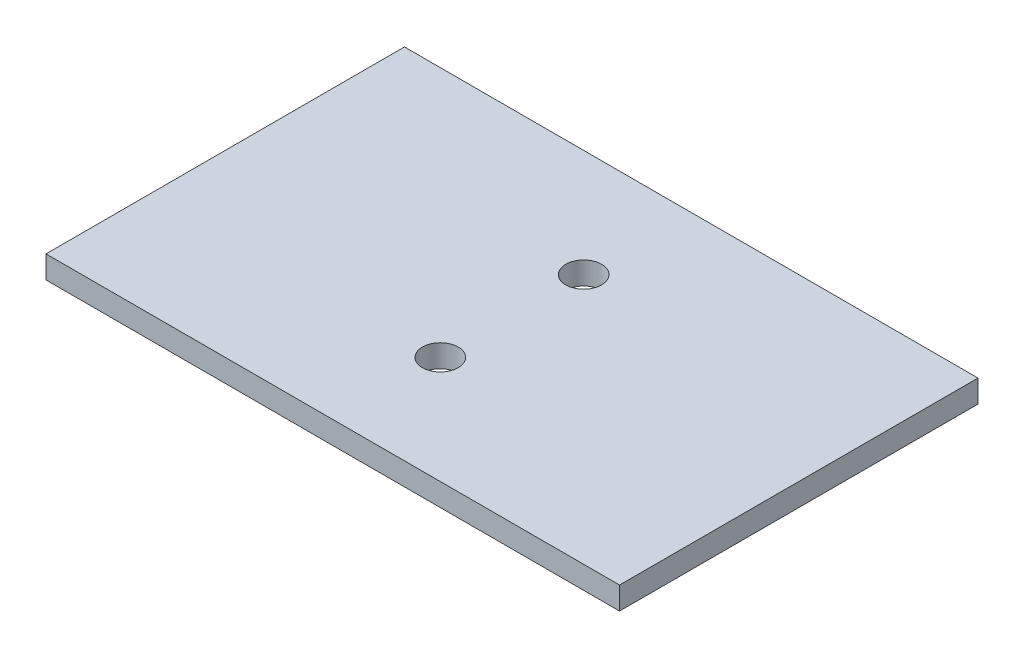
ISO-10303-21;
HEADER;
FILE_DESCRIPTION(('STEP AP214'),'2;1');
FILE_NAME('part.step','',(''),(''),'','','');
FILE_SCHEMA(('AUTOMOTIVE_DESIGN { 1 0 10303 214 1 1 1 1 }'));
ENDSEC;
DATA;
#1=APPLICATION_CONTEXT('core data for automotive mechanical design processes');
#2=APPLICATION_PROTOCOL_DEFINITION('international standard','automotive_design',2000,#1);
#3=PRODUCT_CONTEXT('',#1,'mechanical');
#4=PRODUCT('Part','Part','',(#3));
#5=PRODUCT_RELATED_PRODUCT_CATEGORY('part','',(#4));
#6=PRODUCT_DEFINITION_FORMATION('','',#4);
#7=PRODUCT_DEFINITION_CONTEXT('part definition',#1,'design');
#8=PRODUCT_DEFINITION('design','',#6,#7);
#9=PRODUCT_DEFINITION_SHAPE('','',#8);
#10=(LENGTH_UNIT() NAMED_UNIT(*) SI_UNIT(.MILLI.,.METRE.));
#11=(NAMED_UNIT(*) PLANE_ANGLE_UNIT() SI_UNIT($,.RADIAN.));
#12=(NAMED_UNIT(*) SI_UNIT($,.STERADIAN.) SOLID_ANGLE_UNIT());
#13=UNCERTAINTY_MEASURE_WITH_UNIT(LENGTH_MEASURE(1.E-05),#10,'distance_accuracy_value','');
#14=(GEOMETRIC_REPRESENTATION_CONTEXT(3) GLOBAL_UNCERTAINTY_ASSIGNED_CONTEXT((#13)) GLOBAL_UNIT_ASSIGNED_CONTEXT((#10,
#11,#12)) REPRESENTATION_CONTEXT('',''));
#15=CARTESIAN_POINT('',(0.,0.,0.));
#16=DIRECTION('',(0.,0.,1.));
#17=DIRECTION('',(1.,0.,0.));
#18=AXIS2_PLACEMENT_3D('',#15,#16,#17);
#19=CARTESIAN_POINT('',(0.,2.,0.));
#20=DIRECTION('',(0.,-1.,0.));
#21=DIRECTION('',(0.,0.,-1.));
#22=AXIS2_PLACEMENT_3D('',#19,#20,#21);
#23=PLANE('',#22);
#24=DIRECTION('',(0.,0.,-1.));
#25=VECTOR('',#24,1.);
#26=CARTESIAN_POINT('',(25.4,2.,15.875));
#27=LINE('',#26,#25);
#28=CARTESIAN_POINT('',(25.4,2.,15.875));
#29=VERTEX_POINT('',#28);
#30=CARTESIAN_POINT('',(25.4,2.,-15.875));
#31=VERTEX_POINT('',#30);
#32=EDGE_CURVE('E84',#29,#31,#27,.T.);
#33=ORIENTED_EDGE('',*,*,#32,.T.);
#34=DIRECTION('',(-1.,0.,0.));
#35=VECTOR('',#34,1.);
#36=CARTESIAN_POINT('',(-25.4,2.,-15.875));
#37=LINE('',#36,#35);
#38=CARTESIAN_POINT('',(-25.4,2.,-15.875));
#39=VERTEX_POINT('',#38);
#40=EDGE_CURVE('E79',#31,#39,#37,.T.);
#41=ORIENTED_EDGE('',*,*,#40,.T.);
#42=DIRECTION('',(0.,0.,1.));
#43=VECTOR('',#42,1.);
#44=CARTESIAN_POINT('',(-25.4,2.,15.875));
#45=LINE('',#44,#43);
#46=CARTESIAN_POINT('',(-25.4,2.,15.875));
#47=VERTEX_POINT('',#46);
#48=EDGE_CURVE('E82',#39,#47,#45,.T.);
#49=ORIENTED_EDGE('',*,*,#48,.T.);
#50=DIRECTION('',(1.,0.,0.));
#51=VECTOR('',#50,1.);
#52=CARTESIAN_POINT('',(-25.4,2.,15.875));
#53=LINE('',#52,#51);
#54=EDGE_CURVE('E49',#47,#29,#53,.T.);
#55=ORIENTED_EDGE('',*,*,#54,.T.);
#56=EDGE_LOOP('',(#33,#41,#49,#55));
#57=FACE_BOUND('',#56,.T.);
#58=CARTESIAN_POINT('',(0.,2.,-6.35));
#59=DIRECTION('',(0.,1.,0.));
#60=DIRECTION('',(0.,0.,1.));
#61=AXIS2_PLACEMENT_3D('',#58,#59,#60);
#62=CIRCLE('',#61,1.5875);
#63=CARTESIAN_POINT('',(0.,2.,-4.7625));
#64=VERTEX_POINT('',#63);
#65=EDGE_CURVE('E99',#64,#64,#62,.T.);
#66=ORIENTED_EDGE('',*,*,#65,.F.);
#67=EDGE_LOOP('',(#66));
#68=FACE_BOUND('',#67,.T.);
#69=CARTESIAN_POINT('',(0.,2.,6.35));
#70=DIRECTION('',(0.,1.,0.));
#71=DIRECTION('',(0.,0.,1.));
#72=AXIS2_PLACEMENT_3D('',#69,#70,#71);
#73=CIRCLE('',#72,1.5875);
#74=CARTESIAN_POINT('',(0.,2.,7.9375));
#75=VERTEX_POINT('',#74);
#76=EDGE_CURVE('E114',#75,#75,#73,.T.);
#77=ORIENTED_EDGE('',*,*,#76,.F.);
#78=EDGE_LOOP('',(#77));
#79=FACE_BOUND('',#78,.T.);
#80=ADVANCED_FACE('F32',(#57,#68,#79),#23,.F.);
#81=CARTESIAN_POINT('',(0.,0.,0.));
#82=DIRECTION('',(0.,-1.,0.));
#83=DIRECTION('',(0.,0.,-1.));
#84=AXIS2_PLACEMENT_3D('',#81,#82,#83);
#85=PLANE('',#84);
#86=CARTESIAN_POINT('',(0.,0.,-6.35));
#87=DIRECTION('',(0.,1.,0.));
#88=DIRECTION('',(0.,0.,1.));
#89=AXIS2_PLACEMENT_3D('',#86,#87,#88);
#90=CIRCLE('',#89,1.5875);
#91=CARTESIAN_POINT('',(0.,0.,-4.7625));
#92=VERTEX_POINT('',#91);
#93=EDGE_CURVE('E111',#92,#92,#90,.T.);
#94=ORIENTED_EDGE('',*,*,#93,.T.);
#95=EDGE_LOOP('',(#94));
#96=FACE_BOUND('',#95,.T.);
#97=DIRECTION('',(0.,0.,-1.));
#98=VECTOR('',#97,1.);
#99=CARTESIAN_POINT('',(25.4,0.,15.875));
#100=LINE('',#99,#98);
#101=CARTESIAN_POINT('',(25.4,0.,15.875));
#102=VERTEX_POINT('',#101);
#103=CARTESIAN_POINT('',(25.4,0.,-15.875));
#104=VERTEX_POINT('',#103);
#105=EDGE_CURVE('E96',#102,#104,#100,.T.);
#106=ORIENTED_EDGE('',*,*,#105,.F.);
#107=DIRECTION('',(1.,0.,0.));
#108=VECTOR('',#107,1.);
#109=CARTESIAN_POINT('',(-25.4,0.,15.875));
#110=LINE('',#109,#108);
#111=CARTESIAN_POINT('',(-25.4,0.,15.875));
#112=VERTEX_POINT('',#111);
#113=EDGE_CURVE('E72',#112,#102,#110,.T.);
#114=ORIENTED_EDGE('',*,*,#113,.F.);
#115=DIRECTION('',(0.,0.,1.));
#116=VECTOR('',#115,1.);
#117=CARTESIAN_POINT('',(-25.4,0.,15.875));
#118=LINE('',#117,#116);
#119=CARTESIAN_POINT('',(-25.4,0.,-15.875));
#120=VERTEX_POINT('',#119);
#121=EDGE_CURVE('E66',#120,#112,#118,.T.);
#122=ORIENTED_EDGE('',*,*,#121,.F.);
#123=DIRECTION('',(-1.,0.,0.));
#124=VECTOR('',#123,1.);
#125=CARTESIAN_POINT('',(-25.4,0.,-15.875));
#126=LINE('',#125,#124);
#127=EDGE_CURVE('E88',#104,#120,#126,.T.);
#128=ORIENTED_EDGE('',*,*,#127,.F.);
#129=EDGE_LOOP('',(#106,#114,#122,#128));
#130=FACE_BOUND('',#129,.T.);
#131=CARTESIAN_POINT('',(0.,0.,6.35));
#132=DIRECTION('',(0.,1.,0.));
#133=DIRECTION('',(0.,0.,1.));
#134=AXIS2_PLACEMENT_3D('',#131,#132,#133);
#135=CIRCLE('',#134,1.5875);
#136=CARTESIAN_POINT('',(0.,0.,7.9375));
#137=VERTEX_POINT('',#136);
#138=EDGE_CURVE('E117',#137,#137,#135,.T.);
#139=ORIENTED_EDGE('',*,*,#138,.T.);
#140=EDGE_LOOP('',(#139));
#141=FACE_BOUND('',#140,.T.);
#142=ADVANCED_FACE('F107',(#96,#130,#141),#85,.T.);
#143=CARTESIAN_POINT('',(25.4,2.,15.875));
#144=DIRECTION('',(-1.,0.,0.));
#145=DIRECTION('',(0.,0.,1.));
#146=AXIS2_PLACEMENT_3D('',#143,#144,#145);
#147=PLANE('',#146);
#148=ORIENTED_EDGE('',*,*,#105,.T.);
#149=DIRECTION('',(0.,-1.,0.));
#150=VECTOR('',#149,1.);
#151=CARTESIAN_POINT('',(25.4,2.,-15.875));
#152=LINE('',#151,#150);
#153=EDGE_CURVE('E11',#31,#104,#152,.T.);
#154=ORIENTED_EDGE('',*,*,#153,.F.);
#155=ORIENTED_EDGE('',*,*,#32,.F.);
#156=DIRECTION('',(0.,-1.,0.));
#157=VECTOR('',#156,1.);
#158=CARTESIAN_POINT('',(25.4,2.,15.875));
#159=LINE('',#158,#157);
#160=EDGE_CURVE('E92',#29,#102,#159,.T.);
#161=ORIENTED_EDGE('',*,*,#160,.T.);
#162=EDGE_LOOP('',(#148,#154,#155,#161));
#163=FACE_BOUND('',#162,.T.);
#164=ADVANCED_FACE('F34',(#163),#147,.F.);
#165=CARTESIAN_POINT('',(-25.4,2.,-15.875));
#166=DIRECTION('',(0.,0.,1.));
#167=DIRECTION('',(1.,0.,0.));
#168=AXIS2_PLACEMENT_3D('',#165,#166,#167);
#169=PLANE('',#168);
#170=ORIENTED_EDGE('',*,*,#127,.T.);
#171=DIRECTION('',(0.,-1.,0.));
#172=VECTOR('',#171,1.);
#173=CARTESIAN_POINT('',(-25.4,2.,-15.875));
#174=LINE('',#173,#172);
#175=EDGE_CURVE('E41',#39,#120,#174,.T.);
#176=ORIENTED_EDGE('',*,*,#175,.F.);
#177=ORIENTED_EDGE('',*,*,#40,.F.);
#178=ORIENTED_EDGE('',*,*,#153,.T.);
#179=EDGE_LOOP('',(#170,#176,#177,#178));
#180=FACE_BOUND('',#179,.T.);
#181=ADVANCED_FACE('F87',(#180),#169,.F.);
#182=CARTESIAN_POINT('',(-25.4,2.,15.875));
#183=DIRECTION('',(1.,0.,0.));
#184=DIRECTION('',(0.,0.,-1.));
#185=AXIS2_PLACEMENT_3D('',#182,#183,#184);
#186=PLANE('',#185);
#187=ORIENTED_EDGE('',*,*,#121,.T.);
#188=DIRECTION('',(0.,-1.,0.));
#189=VECTOR('',#188,1.);
#190=CARTESIAN_POINT('',(-25.4,2.,15.875));
#191=LINE('',#190,#189);
#192=EDGE_CURVE('E89',#47,#112,#191,.T.);
#193=ORIENTED_EDGE('',*,*,#192,.F.);
#194=ORIENTED_EDGE('',*,*,#48,.F.);
#195=ORIENTED_EDGE('',*,*,#175,.T.);
#196=EDGE_LOOP('',(#187,#193,#194,#195));
#197=FACE_BOUND('',#196,.T.);
#198=ADVANCED_FACE('F90',(#197),#186,.F.);
#199=CARTESIAN_POINT('',(-25.4,2.,15.875));
#200=DIRECTION('',(0.,0.,-1.));
#201=DIRECTION('',(-1.,0.,0.));
#202=AXIS2_PLACEMENT_3D('',#199,#200,#201);
#203=PLANE('',#202);
#204=ORIENTED_EDGE('',*,*,#113,.T.);
#205=ORIENTED_EDGE('',*,*,#160,.F.);
#206=ORIENTED_EDGE('',*,*,#54,.F.);
#207=ORIENTED_EDGE('',*,*,#192,.T.);
#208=EDGE_LOOP('',(#204,#205,#206,#207));
#209=FACE_BOUND('',#208,.T.);
#210=ADVANCED_FACE('F104',(#209),#203,.F.);
#211=CARTESIAN_POINT('',(0.,2.,-6.35));
#212=DIRECTION('',(0.,-1.,0.));
#213=DIRECTION('',(0.,0.,-1.));
#214=AXIS2_PLACEMENT_3D('',#211,#212,#213);
#215=CYLINDRICAL_SURFACE('',#214,1.5875);
#216=ORIENTED_EDGE('',*,*,#65,.T.);
#217=EDGE_LOOP('',(#216));
#218=FACE_BOUND('',#217,.T.);
#219=ORIENTED_EDGE('',*,*,#93,.F.);
#220=EDGE_LOOP('',(#219));
#221=FACE_BOUND('',#220,.T.);
#222=ADVANCED_FACE('F134',(#218,#221),#215,.F.);
#223=CARTESIAN_POINT('',(0.,2.,6.35));
#224=DIRECTION('',(0.,-1.,0.));
#225=DIRECTION('',(0.,0.,-1.));
#226=AXIS2_PLACEMENT_3D('',#223,#224,#225);
#227=CYLINDRICAL_SURFACE('',#226,1.5875);
#228=ORIENTED_EDGE('',*,*,#76,.T.);
#229=EDGE_LOOP('',(#228));
#230=FACE_BOUND('',#229,.T.);
#231=ORIENTED_EDGE('',*,*,#138,.F.);
#232=EDGE_LOOP('',(#231));
#233=FACE_BOUND('',#232,.T.);
#234=ADVANCED_FACE('F123',(#230,#233),#227,.F.);
#235=CLOSED_SHELL('',(#80,#142,#164,#181,#198,#210,#222,#234));
#236=MANIFOLD_SOLID_BREP('B2',#235);
#237=ADVANCED_BREP_SHAPE_REPRESENTATION('',(#18,#236),#14);
#238=SHAPE_DEFINITION_REPRESENTATION(#9,#237);
ENDSEC;
END-ISO-10303-21;
